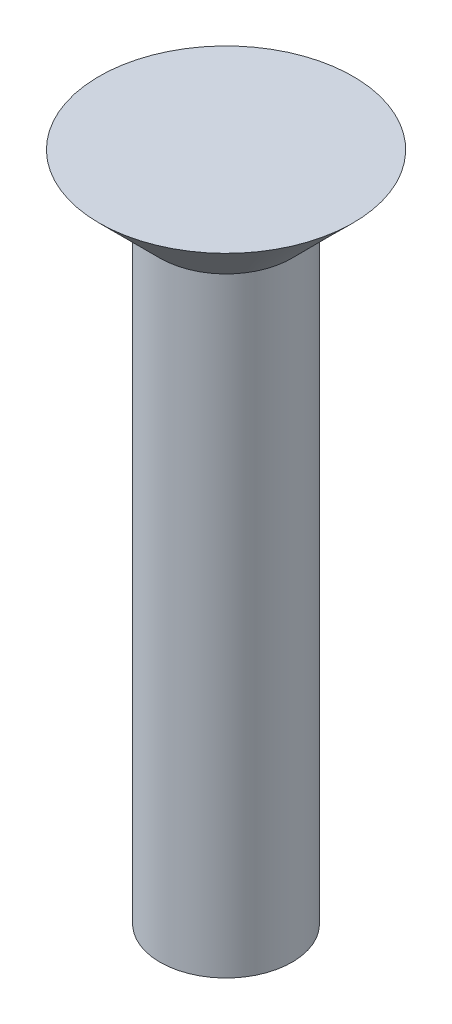
ISO-10303-21;
HEADER;
FILE_DESCRIPTION(('STEP AP214'),'2;1');
FILE_NAME('part.step','',(''),(''),'','','');
FILE_SCHEMA(('AUTOMOTIVE_DESIGN { 1 0 10303 214 1 1 1 1 }'));
ENDSEC;
DATA;
#1=APPLICATION_CONTEXT('core data for automotive mechanical design processes');
#2=APPLICATION_PROTOCOL_DEFINITION('international standard','automotive_design',2000,#1);
#3=PRODUCT_CONTEXT('',#1,'mechanical');
#4=PRODUCT('Part','Part','',(#3));
#5=PRODUCT_RELATED_PRODUCT_CATEGORY('part','',(#4));
#6=PRODUCT_DEFINITION_FORMATION('','',#4);
#7=PRODUCT_DEFINITION_CONTEXT('part definition',#1,'design');
#8=PRODUCT_DEFINITION('design','',#6,#7);
#9=PRODUCT_DEFINITION_SHAPE('','',#8);
#10=(LENGTH_UNIT() NAMED_UNIT(*) SI_UNIT(.MILLI.,.METRE.));
#11=(NAMED_UNIT(*) PLANE_ANGLE_UNIT() SI_UNIT($,.RADIAN.));
#12=(NAMED_UNIT(*) SI_UNIT($,.STERADIAN.) SOLID_ANGLE_UNIT());
#13=UNCERTAINTY_MEASURE_WITH_UNIT(LENGTH_MEASURE(1.E-05),#10,'distance_accuracy_value','');
#14=(GEOMETRIC_REPRESENTATION_CONTEXT(3) GLOBAL_UNCERTAINTY_ASSIGNED_CONTEXT((#13)) GLOBAL_UNIT_ASSIGNED_CONTEXT((#10,
#11,#12)) REPRESENTATION_CONTEXT('',''));
#15=CARTESIAN_POINT('',(0.,0.,0.));
#16=DIRECTION('',(0.,0.,1.));
#17=DIRECTION('',(1.,0.,0.));
#18=AXIS2_PLACEMENT_3D('',#15,#16,#17);
#19=CARTESIAN_POINT('',(0.,0.,0.));
#20=DIRECTION('',(0.,1.,0.));
#21=DIRECTION('',(0.,0.,1.));
#22=AXIS2_PLACEMENT_3D('',#19,#20,#21);
#23=PLANE('',#22);
#24=CARTESIAN_POINT('',(0.,0.,0.));
#25=DIRECTION('',(0.,1.,0.));
#26=DIRECTION('',(0.,0.,1.));
#27=AXIS2_PLACEMENT_3D('',#24,#25,#26);
#28=CIRCLE('',#27,1.3);
#29=CARTESIAN_POINT('',(0.,0.,1.3));
#30=VERTEX_POINT('',#29);
#31=EDGE_CURVE('E10',#30,#30,#28,.T.);
#32=ORIENTED_EDGE('',*,*,#31,.F.);
#33=EDGE_LOOP('',(#32));
#34=FACE_BOUND('',#33,.T.);
#35=ADVANCED_FACE('F30',(#34),#23,.F.);
#36=CARTESIAN_POINT('',(0.,13.2,0.));
#37=DIRECTION('',(0.,1.,0.));
#38=DIRECTION('',(0.,0.,1.));
#39=AXIS2_PLACEMENT_3D('',#36,#37,#38);
#40=CYLINDRICAL_SURFACE('',#39,1.3);
#41=CARTESIAN_POINT('',(0.,12.,0.));
#42=DIRECTION('',(0.,1.,0.));
#43=DIRECTION('',(0.,0.,1.));
#44=AXIS2_PLACEMENT_3D('',#41,#42,#43);
#45=CIRCLE('',#44,1.3);
#46=CARTESIAN_POINT('',(0.,12.,1.3));
#47=VERTEX_POINT('',#46);
#48=EDGE_CURVE('E36',#47,#47,#45,.T.);
#49=ORIENTED_EDGE('',*,*,#48,.F.);
#50=EDGE_LOOP('',(#49));
#51=FACE_BOUND('',#50,.T.);
#52=ORIENTED_EDGE('',*,*,#31,.T.);
#53=EDGE_LOOP('',(#52));
#54=FACE_BOUND('',#53,.T.);
#55=ADVANCED_FACE('F51',(#51,#54),#40,.T.);
#56=CARTESIAN_POINT('',(0.,12.,0.));
#57=DIRECTION('',(0.,1.,0.));
#58=DIRECTION('',(0.,0.,1.));
#59=AXIS2_PLACEMENT_3D('',#56,#57,#58);
#60=CONICAL_SURFACE('',#59,1.3,0.785398163397448);
#61=CARTESIAN_POINT('',(0.,13.2,0.));
#62=DIRECTION('',(0.,1.,0.));
#63=DIRECTION('',(0.,0.,1.));
#64=AXIS2_PLACEMENT_3D('',#61,#62,#63);
#65=CIRCLE('',#64,2.5);
#66=CARTESIAN_POINT('',(0.,13.2,2.5));
#67=VERTEX_POINT('',#66);
#68=EDGE_CURVE('E40',#67,#67,#65,.T.);
#69=ORIENTED_EDGE('',*,*,#68,.F.);
#70=EDGE_LOOP('',(#69));
#71=FACE_BOUND('',#70,.T.);
#72=ORIENTED_EDGE('',*,*,#48,.T.);
#73=EDGE_LOOP('',(#72));
#74=FACE_BOUND('',#73,.T.);
#75=ADVANCED_FACE('F49',(#71,#74),#60,.T.);
#76=CARTESIAN_POINT('',(2.5,13.2,0.));
#77=DIRECTION('',(0.,-1.,0.));
#78=DIRECTION('',(0.,0.,-1.));
#79=AXIS2_PLACEMENT_3D('',#76,#77,#78);
#80=PLANE('',#79);
#81=ORIENTED_EDGE('',*,*,#68,.T.);
#82=EDGE_LOOP('',(#81));
#83=FACE_BOUND('',#82,.T.);
#84=ADVANCED_FACE('F47',(#83),#80,.F.);
#85=CLOSED_SHELL('',(#35,#55,#75,#84));
#86=MANIFOLD_SOLID_BREP('B2',#85);
#87=ADVANCED_BREP_SHAPE_REPRESENTATION('',(#18,#86),#14);
#88=SHAPE_DEFINITION_REPRESENTATION(#9,#87);
ENDSEC;
END-ISO-10303-21;
